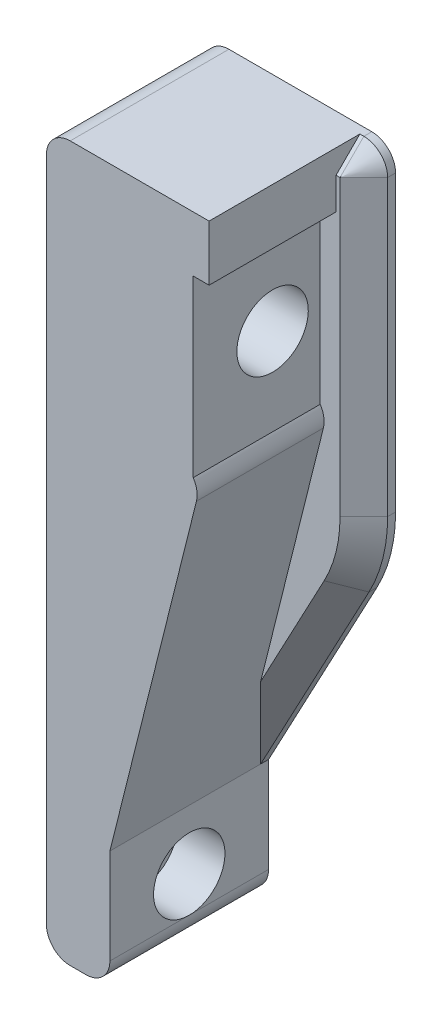
ISO-10303-21;
HEADER;
FILE_DESCRIPTION(('STEP AP214'),'2;1');
FILE_NAME('part.step','',(''),(''),'','','');
FILE_SCHEMA(('AUTOMOTIVE_DESIGN { 1 0 10303 214 1 1 1 1 }'));
ENDSEC;
DATA;
#1=APPLICATION_CONTEXT('core data for automotive mechanical design processes');
#2=APPLICATION_PROTOCOL_DEFINITION('international standard','automotive_design',2000,#1);
#3=PRODUCT_CONTEXT('',#1,'mechanical');
#4=PRODUCT('Part','Part','',(#3));
#5=PRODUCT_RELATED_PRODUCT_CATEGORY('part','',(#4));
#6=PRODUCT_DEFINITION_FORMATION('','',#4);
#7=PRODUCT_DEFINITION_CONTEXT('part definition',#1,'design');
#8=PRODUCT_DEFINITION('design','',#6,#7);
#9=PRODUCT_DEFINITION_SHAPE('','',#8);
#10=(LENGTH_UNIT() NAMED_UNIT(*) SI_UNIT(.MILLI.,.METRE.));
#11=(NAMED_UNIT(*) PLANE_ANGLE_UNIT() SI_UNIT($,.RADIAN.));
#12=(NAMED_UNIT(*) SI_UNIT($,.STERADIAN.) SOLID_ANGLE_UNIT());
#13=UNCERTAINTY_MEASURE_WITH_UNIT(LENGTH_MEASURE(1.E-05),#10,'distance_accuracy_value','');
#14=(GEOMETRIC_REPRESENTATION_CONTEXT(3) GLOBAL_UNCERTAINTY_ASSIGNED_CONTEXT((#13)) GLOBAL_UNIT_ASSIGNED_CONTEXT((#10,
#11,#12)) REPRESENTATION_CONTEXT('',''));
#15=CARTESIAN_POINT('',(0.,0.,0.));
#16=DIRECTION('',(0.,0.,1.));
#17=DIRECTION('',(1.,0.,0.));
#18=AXIS2_PLACEMENT_3D('',#15,#16,#17);
#19=CARTESIAN_POINT('',(0.,7.5,-10.));
#20=DIRECTION('',(1.,0.,0.));
#21=DIRECTION('',(0.,1.,0.));
#22=AXIS2_PLACEMENT_3D('',#19,#20,#21);
#23=CYLINDRICAL_SURFACE('',#22,2.5);
#24=CARTESIAN_POINT('',(0.,7.5,-10.));
#25=DIRECTION('',(1.,0.,0.));
#26=DIRECTION('',(0.,1.,0.));
#27=AXIS2_PLACEMENT_3D('',#24,#25,#26);
#28=CIRCLE('',#27,2.5);
#29=CARTESIAN_POINT('',(0.,10.,-10.));
#30=VERTEX_POINT('',#29);
#31=EDGE_CURVE('E203',#30,#30,#28,.T.);
#32=ORIENTED_EDGE('',*,*,#31,.F.);
#33=EDGE_LOOP('',(#32));
#34=FACE_BOUND('',#33,.T.);
#35=CARTESIAN_POINT('',(2.00000000000002,7.5,-10.));
#36=DIRECTION('',(1.,0.,0.));
#37=DIRECTION('',(0.,1.,0.));
#38=AXIS2_PLACEMENT_3D('',#35,#36,#37);
#39=CIRCLE('',#38,2.5);
#40=CARTESIAN_POINT('',(2.00000000000002,10.,-10.));
#41=VERTEX_POINT('',#40);
#42=EDGE_CURVE('E273',#41,#41,#39,.F.);
#43=ORIENTED_EDGE('',*,*,#42,.F.);
#44=EDGE_LOOP('',(#43));
#45=FACE_BOUND('',#44,.T.);
#46=ADVANCED_FACE('F39',(#34,#45),#23,.F.);
#47=CARTESIAN_POINT('',(0.,72.,-10.));
#48=DIRECTION('',(1.,0.,0.));
#49=DIRECTION('',(0.,1.,0.));
#50=AXIS2_PLACEMENT_3D('',#47,#48,#49);
#51=CYLINDRICAL_SURFACE('',#50,2.5);
#52=CARTESIAN_POINT('',(0.,72.,-10.));
#53=DIRECTION('',(1.,0.,0.));
#54=DIRECTION('',(0.,1.,0.));
#55=AXIS2_PLACEMENT_3D('',#52,#53,#54);
#56=CIRCLE('',#55,2.5);
#57=CARTESIAN_POINT('',(0.,74.5,-10.));
#58=VERTEX_POINT('',#57);
#59=EDGE_CURVE('E206',#58,#58,#56,.T.);
#60=ORIENTED_EDGE('',*,*,#59,.F.);
#61=EDGE_LOOP('',(#60));
#62=FACE_BOUND('',#61,.T.);
#63=CARTESIAN_POINT('',(2.00000000000001,72.,-10.));
#64=DIRECTION('',(1.,0.,0.));
#65=DIRECTION('',(0.,1.,0.));
#66=AXIS2_PLACEMENT_3D('',#63,#64,#65);
#67=CIRCLE('',#66,2.5);
#68=CARTESIAN_POINT('',(2.,74.5,-10.));
#69=VERTEX_POINT('',#68);
#70=EDGE_CURVE('E270',#69,#69,#67,.F.);
#71=ORIENTED_EDGE('',*,*,#70,.F.);
#72=EDGE_LOOP('',(#71));
#73=FACE_BOUND('',#72,.T.);
#74=ADVANCED_FACE('F452',(#62,#73),#51,.F.);
#75=CARTESIAN_POINT('',(24.,0.,-20.));
#76=DIRECTION('',(1.,0.,0.));
#77=DIRECTION('',(0.,0.,-1.));
#78=AXIS2_PLACEMENT_3D('',#75,#76,#77);
#79=PLANE('',#78);
#80=DIRECTION('',(0.,0.,1.));
#81=VECTOR('',#80,1.);
#82=CARTESIAN_POINT('',(24.,87.,-20.));
#83=LINE('',#82,#81);
#84=CARTESIAN_POINT('',(24.,87.,-20.));
#85=VERTEX_POINT('',#84);
#86=CARTESIAN_POINT('',(24.,87.,-19.));
#87=VERTEX_POINT('',#86);
#88=EDGE_CURVE('E304',#85,#87,#83,.T.);
#89=ORIENTED_EDGE('',*,*,#88,.T.);
#90=DIRECTION('',(0.,-1.,0.));
#91=VECTOR('',#90,1.);
#92=CARTESIAN_POINT('',(24.,0.,-19.));
#93=LINE('',#92,#91);
#94=CARTESIAN_POINT('',(24.,50.,-19.));
#95=VERTEX_POINT('',#94);
#96=EDGE_CURVE('E333',#87,#95,#93,.T.);
#97=ORIENTED_EDGE('',*,*,#96,.T.);
#98=DIRECTION('',(0.,0.,-1.));
#99=VECTOR('',#98,1.);
#100=CARTESIAN_POINT('',(24.,50.,-20.));
#101=LINE('',#100,#99);
#102=CARTESIAN_POINT('',(24.,50.,-20.));
#103=VERTEX_POINT('',#102);
#104=EDGE_CURVE('E257',#95,#103,#101,.T.);
#105=ORIENTED_EDGE('',*,*,#104,.T.);
#106=DIRECTION('',(0.,1.,0.));
#107=VECTOR('',#106,1.);
#108=CARTESIAN_POINT('',(24.,0.,-20.));
#109=LINE('',#108,#107);
#110=EDGE_CURVE('E251',#103,#85,#109,.T.);
#111=ORIENTED_EDGE('',*,*,#110,.T.);
#112=EDGE_LOOP('',(#89,#97,#105,#111));
#113=FACE_BOUND('',#112,.T.);
#114=ADVANCED_FACE('F458',(#113),#79,.T.);
#115=CARTESIAN_POINT('',(0.,0.,-20.));
#116=DIRECTION('',(-1.,0.,0.));
#117=DIRECTION('',(0.,0.,1.));
#118=AXIS2_PLACEMENT_3D('',#115,#116,#117);
#119=PLANE('',#118);
#120=ORIENTED_EDGE('',*,*,#31,.T.);
#121=EDGE_LOOP('',(#120));
#122=FACE_BOUND('',#121,.T.);
#123=ORIENTED_EDGE('',*,*,#59,.T.);
#124=EDGE_LOOP('',(#123));
#125=FACE_BOUND('',#124,.T.);
#126=DIRECTION('',(0.,-1.,0.));
#127=VECTOR('',#126,1.);
#128=CARTESIAN_POINT('',(0.,0.,0.));
#129=LINE('',#128,#127);
#130=CARTESIAN_POINT('',(0.,87.,0.));
#131=VERTEX_POINT('',#130);
#132=CARTESIAN_POINT('',(0.,3.,0.));
#133=VERTEX_POINT('',#132);
#134=EDGE_CURVE('E236',#131,#133,#129,.T.);
#135=ORIENTED_EDGE('',*,*,#134,.F.);
#136=DIRECTION('',(0.,0.,1.));
#137=VECTOR('',#136,1.);
#138=CARTESIAN_POINT('',(0.,87.,-20.));
#139=LINE('',#138,#137);
#140=CARTESIAN_POINT('',(0.,87.,-20.));
#141=VERTEX_POINT('',#140);
#142=EDGE_CURVE('E294',#131,#141,#139,.F.);
#143=ORIENTED_EDGE('',*,*,#142,.T.);
#144=DIRECTION('',(0.,-1.,0.));
#145=VECTOR('',#144,1.);
#146=CARTESIAN_POINT('',(0.,0.,-20.));
#147=LINE('',#146,#145);
#148=CARTESIAN_POINT('',(0.,3.,-20.));
#149=VERTEX_POINT('',#148);
#150=EDGE_CURVE('E244',#141,#149,#147,.T.);
#151=ORIENTED_EDGE('',*,*,#150,.T.);
#152=DIRECTION('',(0.,0.,1.));
#153=VECTOR('',#152,1.);
#154=CARTESIAN_POINT('',(0.,3.,-20.));
#155=LINE('',#154,#153);
#156=EDGE_CURVE('E291',#149,#133,#155,.T.);
#157=ORIENTED_EDGE('',*,*,#156,.T.);
#158=EDGE_LOOP('',(#135,#143,#151,#157));
#159=FACE_BOUND('',#158,.T.);
#160=ADVANCED_FACE('F426',(#122,#125,#159),#119,.T.);
#161=CARTESIAN_POINT('',(0.,90.,-20.));
#162=DIRECTION('',(0.,1.,0.));
#163=DIRECTION('',(0.,0.,1.));
#164=AXIS2_PLACEMENT_3D('',#161,#162,#163);
#165=PLANE('',#164);
#166=DIRECTION('',(0.,0.,1.));
#167=VECTOR('',#166,1.);
#168=CARTESIAN_POINT('',(20.5,90.,-16.));
#169=LINE('',#168,#167);
#170=CARTESIAN_POINT('',(20.5,90.,-19.));
#171=VERTEX_POINT('',#170);
#172=CARTESIAN_POINT('',(20.5,90.,0.));
#173=VERTEX_POINT('',#172);
#174=EDGE_CURVE('E241',#171,#173,#169,.T.);
#175=ORIENTED_EDGE('',*,*,#174,.F.);
#176=DIRECTION('',(1.,0.,0.));
#177=VECTOR('',#176,1.);
#178=CARTESIAN_POINT('',(0.,90.,-19.));
#179=LINE('',#178,#177);
#180=CARTESIAN_POINT('',(21.,90.,-19.));
#181=VERTEX_POINT('',#180);
#182=EDGE_CURVE('E329',#171,#181,#179,.T.);
#183=ORIENTED_EDGE('',*,*,#182,.T.);
#184=DIRECTION('',(0.,0.,1.));
#185=VECTOR('',#184,1.);
#186=CARTESIAN_POINT('',(21.,90.,-20.));
#187=LINE('',#186,#185);
#188=CARTESIAN_POINT('',(21.,90.,-20.));
#189=VERTEX_POINT('',#188);
#190=EDGE_CURVE('E269',#181,#189,#187,.F.);
#191=ORIENTED_EDGE('',*,*,#190,.T.);
#192=DIRECTION('',(-1.,0.,0.));
#193=VECTOR('',#192,1.);
#194=CARTESIAN_POINT('',(0.,90.,-20.));
#195=LINE('',#194,#193);
#196=CARTESIAN_POINT('',(3.,90.,-20.));
#197=VERTEX_POINT('',#196);
#198=EDGE_CURVE('E254',#189,#197,#195,.T.);
#199=ORIENTED_EDGE('',*,*,#198,.T.);
#200=DIRECTION('',(0.,0.,1.));
#201=VECTOR('',#200,1.);
#202=CARTESIAN_POINT('',(3.,90.,-20.));
#203=LINE('',#202,#201);
#204=CARTESIAN_POINT('',(3.,90.,0.));
#205=VERTEX_POINT('',#204);
#206=EDGE_CURVE('E280',#197,#205,#203,.T.);
#207=ORIENTED_EDGE('',*,*,#206,.T.);
#208=DIRECTION('',(-1.,0.,0.));
#209=VECTOR('',#208,1.);
#210=CARTESIAN_POINT('',(0.,90.,0.));
#211=LINE('',#210,#209);
#212=EDGE_CURVE('E248',#173,#205,#211,.T.);
#213=ORIENTED_EDGE('',*,*,#212,.F.);
#214=EDGE_LOOP('',(#175,#183,#191,#199,#207,#213));
#215=FACE_BOUND('',#214,.T.);
#216=ADVANCED_FACE('F417',(#215),#165,.T.);
#217=CARTESIAN_POINT('',(0.,0.,-20.));
#218=DIRECTION('',(0.,-1.,0.));
#219=DIRECTION('',(0.,0.,-1.));
#220=AXIS2_PLACEMENT_3D('',#217,#218,#219);
#221=PLANE('',#220);
#222=DIRECTION('',(1.,0.,0.));
#223=VECTOR('',#222,1.);
#224=CARTESIAN_POINT('',(0.,0.,-20.));
#225=LINE('',#224,#223);
#226=CARTESIAN_POINT('',(3.,0.,-20.));
#227=VERTEX_POINT('',#226);
#228=CARTESIAN_POINT('',(5.,0.,-20.));
#229=VERTEX_POINT('',#228);
#230=EDGE_CURVE('E247',#227,#229,#225,.T.);
#231=ORIENTED_EDGE('',*,*,#230,.T.);
#232=DIRECTION('',(0.,0.,1.));
#233=VECTOR('',#232,1.);
#234=CARTESIAN_POINT('',(5.,0.,0.));
#235=LINE('',#234,#233);
#236=CARTESIAN_POINT('',(5.,0.,0.));
#237=VERTEX_POINT('',#236);
#238=EDGE_CURVE('E312',#229,#237,#235,.T.);
#239=ORIENTED_EDGE('',*,*,#238,.T.);
#240=DIRECTION('',(1.,0.,0.));
#241=VECTOR('',#240,1.);
#242=CARTESIAN_POINT('',(0.,0.,0.));
#243=LINE('',#242,#241);
#244=CARTESIAN_POINT('',(3.,0.,0.));
#245=VERTEX_POINT('',#244);
#246=EDGE_CURVE('E260',#245,#237,#243,.T.);
#247=ORIENTED_EDGE('',*,*,#246,.F.);
#248=DIRECTION('',(0.,0.,1.));
#249=VECTOR('',#248,1.);
#250=CARTESIAN_POINT('',(3.,0.,-20.));
#251=LINE('',#250,#249);
#252=EDGE_CURVE('E310',#245,#227,#251,.F.);
#253=ORIENTED_EDGE('',*,*,#252,.T.);
#254=EDGE_LOOP('',(#231,#239,#247,#253));
#255=FACE_BOUND('',#254,.T.);
#256=ADVANCED_FACE('F434',(#255),#221,.T.);
#257=CARTESIAN_POINT('',(0.,0.,-20.));
#258=DIRECTION('',(0.,0.,-1.));
#259=DIRECTION('',(-1.,0.,0.));
#260=AXIS2_PLACEMENT_3D('',#257,#258,#259);
#261=PLANE('',#260);
#262=ORIENTED_EDGE('',*,*,#150,.F.);
#263=CARTESIAN_POINT('',(3.,87.,-20.));
#264=DIRECTION('',(0.,0.,-1.));
#265=DIRECTION('',(-1.,0.,0.));
#266=AXIS2_PLACEMENT_3D('',#263,#264,#265);
#267=CIRCLE('',#266,3.);
#268=EDGE_CURVE('E302',#141,#197,#267,.T.);
#269=ORIENTED_EDGE('',*,*,#268,.T.);
#270=ORIENTED_EDGE('',*,*,#198,.F.);
#271=CARTESIAN_POINT('',(21.,87.,-20.));
#272=DIRECTION('',(0.,0.,-1.));
#273=DIRECTION('',(-1.,0.,0.));
#274=AXIS2_PLACEMENT_3D('',#271,#272,#273);
#275=CIRCLE('',#274,3.);
#276=EDGE_CURVE('E300',#189,#85,#275,.T.);
#277=ORIENTED_EDGE('',*,*,#276,.T.);
#278=ORIENTED_EDGE('',*,*,#110,.F.);
#279=CARTESIAN_POINT('',(4.,50.,-20.));
#280=DIRECTION('',(0.,0.,-1.));
#281=DIRECTION('',(-1.,0.,0.));
#282=AXIS2_PLACEMENT_3D('',#279,#280,#281);
#283=CIRCLE('',#282,20.);
#284=CARTESIAN_POINT('',(21.6470588235294,40.5882352941177,-20.));
#285=VERTEX_POINT('',#284);
#286=EDGE_CURVE('E202',#103,#285,#283,.T.);
#287=ORIENTED_EDGE('',*,*,#286,.T.);
#288=DIRECTION('',(0.470588235294118,0.882352941176471,0.));
#289=VECTOR('',#288,1.);
#290=CARTESIAN_POINT('',(24.,45.,-20.));
#291=LINE('',#290,#289);
#292=CARTESIAN_POINT('',(8.,15.,-20.));
#293=VERTEX_POINT('',#292);
#294=EDGE_CURVE('E181',#293,#285,#291,.T.);
#295=ORIENTED_EDGE('',*,*,#294,.F.);
#296=DIRECTION('',(0.,1.,0.));
#297=VECTOR('',#296,1.);
#298=CARTESIAN_POINT('',(8.,15.,-20.));
#299=LINE('',#298,#297);
#300=CARTESIAN_POINT('',(8.,3.,-20.));
#301=VERTEX_POINT('',#300);
#302=EDGE_CURVE('E187',#301,#293,#299,.T.);
#303=ORIENTED_EDGE('',*,*,#302,.F.);
#304=CARTESIAN_POINT('',(5.,3.,-20.));
#305=DIRECTION('',(0.,0.,-1.));
#306=DIRECTION('',(-1.,0.,0.));
#307=AXIS2_PLACEMENT_3D('',#304,#305,#306);
#308=CIRCLE('',#307,3.);
#309=EDGE_CURVE('E298',#301,#229,#308,.T.);
#310=ORIENTED_EDGE('',*,*,#309,.T.);
#311=ORIENTED_EDGE('',*,*,#230,.F.);
#312=CARTESIAN_POINT('',(3.,3.,-20.));
#313=DIRECTION('',(0.,0.,-1.));
#314=DIRECTION('',(-1.,0.,0.));
#315=AXIS2_PLACEMENT_3D('',#312,#313,#314);
#316=CIRCLE('',#315,3.);
#317=EDGE_CURVE('E296',#227,#149,#316,.T.);
#318=ORIENTED_EDGE('',*,*,#317,.T.);
#319=EDGE_LOOP('',(#262,#269,#270,#277,#278,#287,#295,#303,#310,#311,#318));
#320=FACE_BOUND('',#319,.T.);
#321=ADVANCED_FACE('F199',(#320),#261,.T.);
#322=CARTESIAN_POINT('',(0.,0.,0.));
#323=DIRECTION('',(0.,0.,-1.));
#324=DIRECTION('',(-1.,0.,0.));
#325=AXIS2_PLACEMENT_3D('',#322,#323,#324);
#326=PLANE('',#325);
#327=ORIENTED_EDGE('',*,*,#212,.T.);
#328=CARTESIAN_POINT('',(3.,87.,0.));
#329=DIRECTION('',(0.,0.,-1.));
#330=DIRECTION('',(-1.,0.,0.));
#331=AXIS2_PLACEMENT_3D('',#328,#329,#330);
#332=CIRCLE('',#331,3.);
#333=EDGE_CURVE('E289',#205,#131,#332,.F.);
#334=ORIENTED_EDGE('',*,*,#333,.T.);
#335=ORIENTED_EDGE('',*,*,#134,.T.);
#336=CARTESIAN_POINT('',(3.,3.,0.));
#337=DIRECTION('',(0.,0.,-1.));
#338=DIRECTION('',(-1.,0.,0.));
#339=AXIS2_PLACEMENT_3D('',#336,#337,#338);
#340=CIRCLE('',#339,3.);
#341=EDGE_CURVE('E283',#133,#245,#340,.F.);
#342=ORIENTED_EDGE('',*,*,#341,.T.);
#343=ORIENTED_EDGE('',*,*,#246,.T.);
#344=CARTESIAN_POINT('',(5.,3.,0.));
#345=DIRECTION('',(0.,0.,-1.));
#346=DIRECTION('',(-1.,0.,0.));
#347=AXIS2_PLACEMENT_3D('',#344,#345,#346);
#348=CIRCLE('',#347,3.);
#349=CARTESIAN_POINT('',(8.,3.,0.));
#350=VERTEX_POINT('',#349);
#351=EDGE_CURVE('E285',#237,#350,#348,.F.);
#352=ORIENTED_EDGE('',*,*,#351,.T.);
#353=DIRECTION('',(0.,-1.,0.));
#354=VECTOR('',#353,1.);
#355=CARTESIAN_POINT('',(8.,0.,0.));
#356=LINE('',#355,#354);
#357=CARTESIAN_POINT('',(8.,15.,0.));
#358=VERTEX_POINT('',#357);
#359=EDGE_CURVE('E223',#358,#350,#356,.T.);
#360=ORIENTED_EDGE('',*,*,#359,.F.);
#361=DIRECTION('',(-0.242535625036333,-0.970142500145332,0.));
#362=VECTOR('',#361,1.);
#363=CARTESIAN_POINT('',(19.5,61.,0.));
#364=LINE('',#363,#362);
#365=CARTESIAN_POINT('',(18.9054154104634,58.6216616418535,0.));
#366=VERTEX_POINT('',#365);
#367=EDGE_CURVE('E186',#366,#358,#364,.T.);
#368=ORIENTED_EDGE('',*,*,#367,.F.);
#369=CARTESIAN_POINT('',(15.9949879100274,59.3492685169625,0.));
#370=DIRECTION('',(0.,0.,-1.));
#371=DIRECTION('',(-1.,0.,0.));
#372=AXIS2_PLACEMENT_3D('',#369,#370,#371);
#373=CIRCLE('',#372,3.);
#374=CARTESIAN_POINT('',(18.5,61.,0.));
#375=VERTEX_POINT('',#374);
#376=EDGE_CURVE('E287',#366,#375,#373,.F.);
#377=ORIENTED_EDGE('',*,*,#376,.T.);
#378=DIRECTION('',(0.,-1.,0.));
#379=VECTOR('',#378,1.);
#380=CARTESIAN_POINT('',(18.5,83.,0.));
#381=LINE('',#380,#379);
#382=CARTESIAN_POINT('',(18.5,83.,0.));
#383=VERTEX_POINT('',#382);
#384=EDGE_CURVE('E214',#383,#375,#381,.T.);
#385=ORIENTED_EDGE('',*,*,#384,.F.);
#386=DIRECTION('',(-1.,0.,0.));
#387=VECTOR('',#386,1.);
#388=CARTESIAN_POINT('',(20.5,83.,0.));
#389=LINE('',#388,#387);
#390=CARTESIAN_POINT('',(20.5,83.,0.));
#391=VERTEX_POINT('',#390);
#392=EDGE_CURVE('E228',#391,#383,#389,.T.);
#393=ORIENTED_EDGE('',*,*,#392,.F.);
#394=DIRECTION('',(0.,-1.,0.));
#395=VECTOR('',#394,1.);
#396=CARTESIAN_POINT('',(20.5,83.,0.));
#397=LINE('',#396,#395);
#398=EDGE_CURVE('E225',#173,#391,#397,.T.);
#399=ORIENTED_EDGE('',*,*,#398,.F.);
#400=EDGE_LOOP('',(#327,#334,#335,#342,#343,#352,#360,#368,#377,#385,#393,#399));
#401=FACE_BOUND('',#400,.T.);
#402=ADVANCED_FACE('F414',(#401),#326,.F.);
#403=CARTESIAN_POINT('',(19.5,61.,-16.));
#404=DIRECTION('',(-0.970142500145332,0.242535625036333,0.));
#405=DIRECTION('',(-0.242535625036333,-0.970142500145332,0.));
#406=AXIS2_PLACEMENT_3D('',#403,#404,#405);
#407=PLANE('',#406);
#408=DIRECTION('',(-0.242535625036333,-0.970142500145332,0.));
#409=VECTOR('',#408,1.);
#410=CARTESIAN_POINT('',(19.5,61.,-16.));
#411=LINE('',#410,#409);
#412=CARTESIAN_POINT('',(18.9054154104634,58.6216616418535,-16.));
#413=VERTEX_POINT('',#412);
#414=CARTESIAN_POINT('',(11.,27.0000000000001,-16.));
#415=VERTEX_POINT('',#414);
#416=EDGE_CURVE('E210',#413,#415,#411,.T.);
#417=ORIENTED_EDGE('',*,*,#416,.F.);
#418=DIRECTION('',(0.,0.,-1.));
#419=VECTOR('',#418,1.);
#420=CARTESIAN_POINT('',(18.9054154104634,58.6216616418535,-16.));
#421=LINE('',#420,#419);
#422=EDGE_CURVE('E307',#413,#366,#421,.F.);
#423=ORIENTED_EDGE('',*,*,#422,.T.);
#424=ORIENTED_EDGE('',*,*,#367,.T.);
#425=DIRECTION('',(0.,0.,1.));
#426=VECTOR('',#425,1.);
#427=CARTESIAN_POINT('',(8.,15.,-16.));
#428=LINE('',#427,#426);
#429=CARTESIAN_POINT('',(8.,15.,-19.));
#430=VERTEX_POINT('',#429);
#431=EDGE_CURVE('E56',#430,#358,#428,.T.);
#432=ORIENTED_EDGE('',*,*,#431,.F.);
#433=DIRECTION('',(0.235702260395516,0.942809041582064,0.235702260395514));
#434=VECTOR('',#433,1.);
#435=CARTESIAN_POINT('',(19.0277777777778,59.1111111111111,-7.97222222222229));
#436=LINE('',#435,#434);
#437=EDGE_CURVE('E11',#430,#415,#436,.T.);
#438=ORIENTED_EDGE('',*,*,#437,.T.);
#439=EDGE_LOOP('',(#417,#423,#424,#432,#438));
#440=FACE_BOUND('',#439,.T.);
#441=ADVANCED_FACE('F380',(#440),#407,.F.);
#442=CARTESIAN_POINT('',(18.5,83.,-16.));
#443=DIRECTION('',(-1.,0.,0.));
#444=DIRECTION('',(0.,-1.,0.));
#445=AXIS2_PLACEMENT_3D('',#442,#443,#444);
#446=PLANE('',#445);
#447=CARTESIAN_POINT('',(18.5,72.,-10.));
#448=DIRECTION('',(1.,0.,0.));
#449=DIRECTION('',(0.,1.,0.));
#450=AXIS2_PLACEMENT_3D('',#447,#448,#449);
#451=CIRCLE('',#450,4.5);
#452=CARTESIAN_POINT('',(18.5,76.5,-10.));
#453=VERTEX_POINT('',#452);
#454=EDGE_CURVE('E356',#453,#453,#451,.T.);
#455=ORIENTED_EDGE('',*,*,#454,.F.);
#456=EDGE_LOOP('',(#455));
#457=FACE_BOUND('',#456,.T.);
#458=ORIENTED_EDGE('',*,*,#384,.T.);
#459=DIRECTION('',(0.,0.,1.));
#460=VECTOR('',#459,1.);
#461=CARTESIAN_POINT('',(18.5,61.,-16.));
#462=LINE('',#461,#460);
#463=CARTESIAN_POINT('',(18.5,61.,-16.));
#464=VERTEX_POINT('',#463);
#465=EDGE_CURVE('E233',#464,#375,#462,.T.);
#466=ORIENTED_EDGE('',*,*,#465,.F.);
#467=DIRECTION('',(0.,-1.,0.));
#468=VECTOR('',#467,1.);
#469=CARTESIAN_POINT('',(18.5,83.,-16.));
#470=LINE('',#469,#468);
#471=CARTESIAN_POINT('',(18.5,83.,-16.));
#472=VERTEX_POINT('',#471);
#473=EDGE_CURVE('E219',#472,#464,#470,.T.);
#474=ORIENTED_EDGE('',*,*,#473,.F.);
#475=DIRECTION('',(0.,0.,1.));
#476=VECTOR('',#475,1.);
#477=CARTESIAN_POINT('',(18.5,83.,-16.));
#478=LINE('',#477,#476);
#479=EDGE_CURVE('E237',#472,#383,#478,.T.);
#480=ORIENTED_EDGE('',*,*,#479,.T.);
#481=EDGE_LOOP('',(#458,#466,#474,#480));
#482=FACE_BOUND('',#481,.T.);
#483=ADVANCED_FACE('F376',(#457,#482),#446,.F.);
#484=CARTESIAN_POINT('',(20.5,83.,-16.));
#485=DIRECTION('',(0.,1.,0.));
#486=DIRECTION('',(0.,0.,1.));
#487=AXIS2_PLACEMENT_3D('',#484,#485,#486);
#488=PLANE('',#487);
#489=ORIENTED_EDGE('',*,*,#392,.T.);
#490=ORIENTED_EDGE('',*,*,#479,.F.);
#491=DIRECTION('',(-1.,0.,0.));
#492=VECTOR('',#491,1.);
#493=CARTESIAN_POINT('',(20.5,83.,-16.));
#494=LINE('',#493,#492);
#495=CARTESIAN_POINT('',(20.5,83.,-16.));
#496=VERTEX_POINT('',#495);
#497=EDGE_CURVE('E216',#496,#472,#494,.T.);
#498=ORIENTED_EDGE('',*,*,#497,.F.);
#499=DIRECTION('',(0.,0.,1.));
#500=VECTOR('',#499,1.);
#501=CARTESIAN_POINT('',(20.5,83.,-16.));
#502=LINE('',#501,#500);
#503=EDGE_CURVE('E239',#496,#391,#502,.T.);
#504=ORIENTED_EDGE('',*,*,#503,.T.);
#505=EDGE_LOOP('',(#489,#490,#498,#504));
#506=FACE_BOUND('',#505,.T.);
#507=ADVANCED_FACE('F379',(#506),#488,.F.);
#508=CARTESIAN_POINT('',(20.5,83.,-16.));
#509=DIRECTION('',(-1.,0.,0.));
#510=DIRECTION('',(0.,0.,1.));
#511=AXIS2_PLACEMENT_3D('',#508,#509,#510);
#512=PLANE('',#511);
#513=ORIENTED_EDGE('',*,*,#398,.T.);
#514=ORIENTED_EDGE('',*,*,#503,.F.);
#515=DIRECTION('',(0.,-1.,0.));
#516=VECTOR('',#515,1.);
#517=CARTESIAN_POINT('',(20.5,83.,-16.));
#518=LINE('',#517,#516);
#519=CARTESIAN_POINT('',(20.5,87.,-16.));
#520=VERTEX_POINT('',#519);
#521=EDGE_CURVE('E213',#520,#496,#518,.T.);
#522=ORIENTED_EDGE('',*,*,#521,.F.);
#523=DIRECTION('',(0.,-0.707106781186549,0.707106781186546));
#524=VECTOR('',#523,1.);
#525=CARTESIAN_POINT('',(20.5,85.,-14.));
#526=LINE('',#525,#524);
#527=EDGE_CURVE('E49',#520,#171,#526,.F.);
#528=ORIENTED_EDGE('',*,*,#527,.T.);
#529=ORIENTED_EDGE('',*,*,#174,.T.);
#530=EDGE_LOOP('',(#513,#514,#522,#528,#529));
#531=FACE_BOUND('',#530,.T.);
#532=ADVANCED_FACE('F410',(#531),#512,.F.);
#533=CARTESIAN_POINT('',(8.,0.,-16.));
#534=DIRECTION('',(-1.,0.,0.));
#535=DIRECTION('',(0.,0.,1.));
#536=AXIS2_PLACEMENT_3D('',#533,#534,#535);
#537=PLANE('',#536);
#538=ORIENTED_EDGE('',*,*,#359,.T.);
#539=DIRECTION('',(0.,0.,1.));
#540=VECTOR('',#539,1.);
#541=CARTESIAN_POINT('',(8.,3.,-20.));
#542=LINE('',#541,#540);
#543=CARTESIAN_POINT('',(8.,3.,-10.));
#544=VERTEX_POINT('',#543);
#545=EDGE_CURVE('E316',#350,#544,#542,.F.);
#546=ORIENTED_EDGE('',*,*,#545,.T.);
#547=CARTESIAN_POINT('',(8.,7.5,-10.));
#548=DIRECTION('',(-1.,0.,0.));
#549=DIRECTION('',(0.,0.,1.));
#550=AXIS2_PLACEMENT_3D('',#547,#548,#549);
#551=CIRCLE('',#550,4.5);
#552=EDGE_CURVE('E277',#544,#544,#551,.T.);
#553=ORIENTED_EDGE('',*,*,#552,.T.);
#554=DIRECTION('',(0.,0.,1.));
#555=VECTOR('',#554,1.);
#556=CARTESIAN_POINT('',(8.,3.,-20.));
#557=LINE('',#556,#555);
#558=EDGE_CURVE('E194',#544,#301,#557,.F.);
#559=ORIENTED_EDGE('',*,*,#558,.T.);
#560=ORIENTED_EDGE('',*,*,#302,.T.);
#561=DIRECTION('',(0.,0.,-1.));
#562=VECTOR('',#561,1.);
#563=CARTESIAN_POINT('',(8.,15.,-10.));
#564=LINE('',#563,#562);
#565=EDGE_CURVE('E177',#430,#293,#564,.T.);
#566=ORIENTED_EDGE('',*,*,#565,.F.);
#567=ORIENTED_EDGE('',*,*,#431,.T.);
#568=EDGE_LOOP('',(#538,#546,#553,#559,#560,#566,#567));
#569=FACE_BOUND('',#568,.T.);
#570=ADVANCED_FACE('F191',(#569),#537,.F.);
#571=CARTESIAN_POINT('',(0.,0.,-16.));
#572=DIRECTION('',(0.,0.,1.));
#573=DIRECTION('',(1.,0.,0.));
#574=AXIS2_PLACEMENT_3D('',#571,#572,#573);
#575=PLANE('',#574);
#576=DIRECTION('',(0.,1.,0.));
#577=VECTOR('',#576,1.);
#578=CARTESIAN_POINT('',(21.,0.,-16.));
#579=LINE('',#578,#577);
#580=CARTESIAN_POINT('',(21.,50.,-16.));
#581=VERTEX_POINT('',#580);
#582=CARTESIAN_POINT('',(21.,87.,-16.));
#583=VERTEX_POINT('',#582);
#584=EDGE_CURVE('E324',#581,#583,#579,.T.);
#585=ORIENTED_EDGE('',*,*,#584,.T.);
#586=DIRECTION('',(-1.,0.,0.));
#587=VECTOR('',#586,1.);
#588=CARTESIAN_POINT('',(0.,87.,-16.));
#589=LINE('',#588,#587);
#590=EDGE_CURVE('E326',#583,#520,#589,.T.);
#591=ORIENTED_EDGE('',*,*,#590,.T.);
#592=ORIENTED_EDGE('',*,*,#521,.T.);
#593=ORIENTED_EDGE('',*,*,#497,.T.);
#594=ORIENTED_EDGE('',*,*,#473,.T.);
#595=CARTESIAN_POINT('',(15.9949879100274,59.3492685169625,-16.));
#596=DIRECTION('',(0.,0.,1.));
#597=DIRECTION('',(1.,0.,0.));
#598=AXIS2_PLACEMENT_3D('',#595,#596,#597);
#599=CIRCLE('',#598,3.);
#600=EDGE_CURVE('E318',#464,#413,#599,.F.);
#601=ORIENTED_EDGE('',*,*,#600,.T.);
#602=ORIENTED_EDGE('',*,*,#416,.T.);
#603=DIRECTION('',(0.470588235294118,0.882352941176471,0.));
#604=VECTOR('',#603,1.);
#605=CARTESIAN_POINT('',(19.,42.,-16.));
#606=LINE('',#605,#604);
#607=CARTESIAN_POINT('',(19.,42.,-16.));
#608=VERTEX_POINT('',#607);
#609=EDGE_CURVE('E320',#415,#608,#606,.T.);
#610=ORIENTED_EDGE('',*,*,#609,.T.);
#611=CARTESIAN_POINT('',(4.,50.,-16.));
#612=DIRECTION('',(0.,0.,1.));
#613=DIRECTION('',(1.,0.,0.));
#614=AXIS2_PLACEMENT_3D('',#611,#612,#613);
#615=CIRCLE('',#614,17.);
#616=EDGE_CURVE('E322',#608,#581,#615,.T.);
#617=ORIENTED_EDGE('',*,*,#616,.T.);
#618=EDGE_LOOP('',(#585,#591,#592,#593,#594,#601,#602,#610,#617));
#619=FACE_BOUND('',#618,.T.);
#620=ADVANCED_FACE('F392',(#619),#575,.T.);
#621=CARTESIAN_POINT('',(24.,45.,-10.));
#622=DIRECTION('',(-0.882352941176471,0.470588235294118,0.));
#623=DIRECTION('',(-0.470588235294118,-0.882352941176471,0.));
#624=AXIS2_PLACEMENT_3D('',#621,#622,#623);
#625=PLANE('',#624);
#626=DIRECTION('',(0.,0.,-1.));
#627=VECTOR('',#626,1.);
#628=CARTESIAN_POINT('',(21.6470588235294,40.5882352941177,-16.));
#629=LINE('',#628,#627);
#630=CARTESIAN_POINT('',(21.6470588235294,40.5882352941177,-19.));
#631=VERTEX_POINT('',#630);
#632=EDGE_CURVE('E267',#285,#631,#629,.F.);
#633=ORIENTED_EDGE('',*,*,#632,.T.);
#634=DIRECTION('',(-0.470588235294118,-0.882352941176471,0.));
#635=VECTOR('',#634,1.);
#636=CARTESIAN_POINT('',(8.,15.,-19.));
#637=LINE('',#636,#635);
#638=EDGE_CURVE('E183',#631,#430,#637,.T.);
#639=ORIENTED_EDGE('',*,*,#638,.T.);
#640=ORIENTED_EDGE('',*,*,#565,.T.);
#641=ORIENTED_EDGE('',*,*,#294,.T.);
#642=EDGE_LOOP('',(#633,#639,#640,#641));
#643=FACE_BOUND('',#642,.T.);
#644=ADVANCED_FACE('F179',(#643),#625,.F.);
#645=CARTESIAN_POINT('',(4.,50.,-20.));
#646=DIRECTION('',(0.,0.,1.));
#647=DIRECTION('',(1.,0.,0.));
#648=AXIS2_PLACEMENT_3D('',#645,#646,#647);
#649=CYLINDRICAL_SURFACE('',#648,20.);
#650=ORIENTED_EDGE('',*,*,#104,.F.);
#651=CARTESIAN_POINT('',(4.,50.,-19.));
#652=DIRECTION('',(0.,0.,1.));
#653=DIRECTION('',(1.,0.,0.));
#654=AXIS2_PLACEMENT_3D('',#651,#652,#653);
#655=CIRCLE('',#654,20.);
#656=EDGE_CURVE('E64',#95,#631,#655,.F.);
#657=ORIENTED_EDGE('',*,*,#656,.T.);
#658=ORIENTED_EDGE('',*,*,#632,.F.);
#659=ORIENTED_EDGE('',*,*,#286,.F.);
#660=EDGE_LOOP('',(#650,#657,#658,#659));
#661=FACE_BOUND('',#660,.T.);
#662=ADVANCED_FACE('F466',(#661),#649,.T.);
#663=CARTESIAN_POINT('',(2.00000000000001,72.,-10.));
#664=DIRECTION('',(1.,0.,0.));
#665=DIRECTION('',(0.,1.,0.));
#666=AXIS2_PLACEMENT_3D('',#663,#664,#665);
#667=PLANE('',#666);
#668=CARTESIAN_POINT('',(2.00000000000001,72.,-10.));
#669=DIRECTION('',(1.,0.,0.));
#670=DIRECTION('',(0.,1.,0.));
#671=AXIS2_PLACEMENT_3D('',#668,#669,#670);
#672=CIRCLE('',#671,4.5);
#673=CARTESIAN_POINT('',(2.,76.5,-10.));
#674=VERTEX_POINT('',#673);
#675=EDGE_CURVE('E274',#674,#674,#672,.T.);
#676=ORIENTED_EDGE('',*,*,#675,.T.);
#677=EDGE_LOOP('',(#676));
#678=FACE_BOUND('',#677,.T.);
#679=ORIENTED_EDGE('',*,*,#70,.T.);
#680=EDGE_LOOP('',(#679));
#681=FACE_BOUND('',#680,.T.);
#682=ADVANCED_FACE('F366',(#678,#681),#667,.T.);
#683=CARTESIAN_POINT('',(2.00000000000001,72.,-10.));
#684=DIRECTION('',(1.,0.,0.));
#685=DIRECTION('',(0.,1.,0.));
#686=AXIS2_PLACEMENT_3D('',#683,#684,#685);
#687=CYLINDRICAL_SURFACE('',#686,4.5);
#688=ORIENTED_EDGE('',*,*,#675,.F.);
#689=EDGE_LOOP('',(#688));
#690=FACE_BOUND('',#689,.T.);
#691=ORIENTED_EDGE('',*,*,#454,.T.);
#692=EDGE_LOOP('',(#691));
#693=FACE_BOUND('',#692,.T.);
#694=ADVANCED_FACE('F369',(#690,#693),#687,.F.);
#695=CARTESIAN_POINT('',(2.00000000000002,7.5,-10.));
#696=DIRECTION('',(1.,0.,0.));
#697=DIRECTION('',(0.,1.,0.));
#698=AXIS2_PLACEMENT_3D('',#695,#696,#697);
#699=CYLINDRICAL_SURFACE('',#698,4.5);
#700=CARTESIAN_POINT('',(2.00000000000002,7.5,-10.));
#701=DIRECTION('',(1.,0.,0.));
#702=DIRECTION('',(0.,1.,0.));
#703=AXIS2_PLACEMENT_3D('',#700,#701,#702);
#704=CIRCLE('',#703,4.5);
#705=CARTESIAN_POINT('',(2.00000000000002,12.,-10.));
#706=VERTEX_POINT('',#705);
#707=EDGE_CURVE('E351',#706,#706,#704,.T.);
#708=ORIENTED_EDGE('',*,*,#707,.F.);
#709=EDGE_LOOP('',(#708));
#710=FACE_BOUND('',#709,.T.);
#711=ORIENTED_EDGE('',*,*,#552,.F.);
#712=EDGE_LOOP('',(#711));
#713=FACE_BOUND('',#712,.T.);
#714=ADVANCED_FACE('F372',(#710,#713),#699,.F.);
#715=CARTESIAN_POINT('',(2.00000000000002,7.5,-10.));
#716=DIRECTION('',(1.,0.,0.));
#717=DIRECTION('',(0.,1.,0.));
#718=AXIS2_PLACEMENT_3D('',#715,#716,#717);
#719=PLANE('',#718);
#720=ORIENTED_EDGE('',*,*,#707,.T.);
#721=EDGE_LOOP('',(#720));
#722=FACE_BOUND('',#721,.T.);
#723=ORIENTED_EDGE('',*,*,#42,.T.);
#724=EDGE_LOOP('',(#723));
#725=FACE_BOUND('',#724,.T.);
#726=ADVANCED_FACE('F444',(#722,#725),#719,.T.);
#727=CARTESIAN_POINT('',(3.,87.,-20.));
#728=DIRECTION('',(0.,0.,1.));
#729=DIRECTION('',(1.,0.,0.));
#730=AXIS2_PLACEMENT_3D('',#727,#728,#729);
#731=CYLINDRICAL_SURFACE('',#730,3.);
#732=ORIENTED_EDGE('',*,*,#268,.F.);
#733=ORIENTED_EDGE('',*,*,#142,.F.);
#734=ORIENTED_EDGE('',*,*,#333,.F.);
#735=ORIENTED_EDGE('',*,*,#206,.F.);
#736=EDGE_LOOP('',(#732,#733,#734,#735));
#737=FACE_BOUND('',#736,.T.);
#738=ADVANCED_FACE('F422',(#737),#731,.T.);
#739=CARTESIAN_POINT('',(21.,87.,-20.));
#740=DIRECTION('',(0.,0.,1.));
#741=DIRECTION('',(1.,0.,0.));
#742=AXIS2_PLACEMENT_3D('',#739,#740,#741);
#743=CYLINDRICAL_SURFACE('',#742,3.);
#744=ORIENTED_EDGE('',*,*,#190,.F.);
#745=CARTESIAN_POINT('',(21.,87.,-19.));
#746=DIRECTION('',(0.,0.,1.));
#747=DIRECTION('',(1.,0.,0.));
#748=AXIS2_PLACEMENT_3D('',#745,#746,#747);
#749=CIRCLE('',#748,3.);
#750=EDGE_CURVE('E331',#181,#87,#749,.F.);
#751=ORIENTED_EDGE('',*,*,#750,.T.);
#752=ORIENTED_EDGE('',*,*,#88,.F.);
#753=ORIENTED_EDGE('',*,*,#276,.F.);
#754=EDGE_LOOP('',(#744,#751,#752,#753));
#755=FACE_BOUND('',#754,.T.);
#756=ADVANCED_FACE('F495',(#755),#743,.T.);
#757=CARTESIAN_POINT('',(15.9949879100274,59.3492685169625,-16.));
#758=DIRECTION('',(0.,0.,-1.));
#759=DIRECTION('',(-1.,0.,0.));
#760=AXIS2_PLACEMENT_3D('',#757,#758,#759);
#761=CYLINDRICAL_SURFACE('',#760,3.);
#762=ORIENTED_EDGE('',*,*,#600,.F.);
#763=ORIENTED_EDGE('',*,*,#465,.T.);
#764=ORIENTED_EDGE('',*,*,#376,.F.);
#765=ORIENTED_EDGE('',*,*,#422,.F.);
#766=EDGE_LOOP('',(#762,#763,#764,#765));
#767=FACE_BOUND('',#766,.T.);
#768=ADVANCED_FACE('F388',(#767),#761,.T.);
#769=CARTESIAN_POINT('',(5.,3.,-20.));
#770=DIRECTION('',(0.,0.,-1.));
#771=DIRECTION('',(-1.,0.,0.));
#772=AXIS2_PLACEMENT_3D('',#769,#770,#771);
#773=CYLINDRICAL_SURFACE('',#772,3.);
#774=ORIENTED_EDGE('',*,*,#558,.F.);
#775=ORIENTED_EDGE('',*,*,#545,.F.);
#776=ORIENTED_EDGE('',*,*,#351,.F.);
#777=ORIENTED_EDGE('',*,*,#238,.F.);
#778=ORIENTED_EDGE('',*,*,#309,.F.);
#779=EDGE_LOOP('',(#774,#775,#776,#777,#778));
#780=FACE_BOUND('',#779,.T.);
#781=ADVANCED_FACE('F438',(#780),#773,.T.);
#782=CARTESIAN_POINT('',(3.,3.,-20.));
#783=DIRECTION('',(0.,0.,1.));
#784=DIRECTION('',(1.,0.,0.));
#785=AXIS2_PLACEMENT_3D('',#782,#783,#784);
#786=CYLINDRICAL_SURFACE('',#785,3.);
#787=ORIENTED_EDGE('',*,*,#317,.F.);
#788=ORIENTED_EDGE('',*,*,#252,.F.);
#789=ORIENTED_EDGE('',*,*,#341,.F.);
#790=ORIENTED_EDGE('',*,*,#156,.F.);
#791=EDGE_LOOP('',(#787,#788,#789,#790));
#792=FACE_BOUND('',#791,.T.);
#793=ADVANCED_FACE('F430',(#792),#786,.T.);
#794=CARTESIAN_POINT('',(24.,45.,-19.));
#795=DIRECTION('',(0.623917748105775,-0.33275613232308,0.70710678118655));
#796=DIRECTION('',(0.470588235294118,0.882352941176471,0.));
#797=AXIS2_PLACEMENT_3D('',#794,#795,#796);
#798=PLANE('',#797);
#799=ORIENTED_EDGE('',*,*,#437,.F.);
#800=ORIENTED_EDGE('',*,*,#638,.F.);
#801=DIRECTION('',(0.623917748105779,-0.332756132323082,-0.707106781186545));
#802=VECTOR('',#801,1.);
#803=CARTESIAN_POINT('',(19.,42.,-16.));
#804=LINE('',#803,#802);
#805=EDGE_CURVE('E44',#608,#631,#804,.T.);
#806=ORIENTED_EDGE('',*,*,#805,.F.);
#807=ORIENTED_EDGE('',*,*,#609,.F.);
#808=EDGE_LOOP('',(#799,#800,#806,#807));
#809=FACE_BOUND('',#808,.T.);
#810=ADVANCED_FACE('F42',(#809),#798,.T.);
#811=CARTESIAN_POINT('',(4.,50.,-16.));
#812=DIRECTION('',(0.,0.,-1.));
#813=DIRECTION('',(-1.,0.,0.));
#814=AXIS2_PLACEMENT_3D('',#811,#812,#813);
#815=CONICAL_SURFACE('',#814,17.,0.785398163397451);
#816=ORIENTED_EDGE('',*,*,#805,.T.);
#817=ORIENTED_EDGE('',*,*,#656,.F.);
#818=DIRECTION('',(0.707106781186549,0.,-0.707106781186546));
#819=VECTOR('',#818,1.);
#820=CARTESIAN_POINT('',(21.,50.,-16.));
#821=LINE('',#820,#819);
#822=EDGE_CURVE('E344',#581,#95,#821,.T.);
#823=ORIENTED_EDGE('',*,*,#822,.F.);
#824=ORIENTED_EDGE('',*,*,#616,.F.);
#825=EDGE_LOOP('',(#816,#817,#823,#824));
#826=FACE_BOUND('',#825,.T.);
#827=ADVANCED_FACE('F397',(#826),#815,.T.);
#828=CARTESIAN_POINT('',(21.,0.,-16.));
#829=DIRECTION('',(-0.707106781186545,0.,-0.70710678118655));
#830=DIRECTION('',(0.,1.,0.));
#831=AXIS2_PLACEMENT_3D('',#828,#829,#830);
#832=PLANE('',#831);
#833=ORIENTED_EDGE('',*,*,#822,.T.);
#834=ORIENTED_EDGE('',*,*,#96,.F.);
#835=DIRECTION('',(0.70710678118655,0.,-0.707106781186545));
#836=VECTOR('',#835,1.);
#837=CARTESIAN_POINT('',(21.,87.,-16.));
#838=LINE('',#837,#836);
#839=EDGE_CURVE('E342',#583,#87,#838,.T.);
#840=ORIENTED_EDGE('',*,*,#839,.F.);
#841=ORIENTED_EDGE('',*,*,#584,.F.);
#842=EDGE_LOOP('',(#833,#834,#840,#841));
#843=FACE_BOUND('',#842,.T.);
#844=ADVANCED_FACE('F398',(#843),#832,.F.);
#845=CARTESIAN_POINT('',(21.,87.,-19.));
#846=DIRECTION('',(0.,0.,-1.));
#847=DIRECTION('',(-1.,0.,0.));
#848=AXIS2_PLACEMENT_3D('',#845,#846,#847);
#849=CONICAL_SURFACE('',#848,3.00000000000001,0.785398163397451);
#850=ORIENTED_EDGE('',*,*,#839,.T.);
#851=ORIENTED_EDGE('',*,*,#750,.F.);
#852=DIRECTION('',(0.,0.707106781186549,-0.707106781186546));
#853=VECTOR('',#852,1.);
#854=CARTESIAN_POINT('',(21.,87.,-16.));
#855=LINE('',#854,#853);
#856=EDGE_CURVE('E339',#583,#181,#855,.T.);
#857=ORIENTED_EDGE('',*,*,#856,.F.);
#858=EDGE_LOOP('',(#850,#851,#857));
#859=FACE_BOUND('',#858,.T.);
#860=ADVANCED_FACE('F403',(#859),#849,.T.);
#861=CARTESIAN_POINT('',(0.,87.,-16.));
#862=DIRECTION('',(0.,-0.707106781186546,-0.707106781186549));
#863=DIRECTION('',(-1.,0.,0.));
#864=AXIS2_PLACEMENT_3D('',#861,#862,#863);
#865=PLANE('',#864);
#866=ORIENTED_EDGE('',*,*,#856,.T.);
#867=ORIENTED_EDGE('',*,*,#182,.F.);
#868=ORIENTED_EDGE('',*,*,#527,.F.);
#869=ORIENTED_EDGE('',*,*,#590,.F.);
#870=EDGE_LOOP('',(#866,#867,#868,#869));
#871=FACE_BOUND('',#870,.T.);
#872=ADVANCED_FACE('F406',(#871),#865,.F.);
#873=CLOSED_SHELL('',(#46,#74,#114,#160,#216,#256,#321,#402,#441,#483,#507,#532,#570,#620,#644,
#662,#682,#694,#714,#726,#738,#756,#768,#781,#793,#810,#827,#844,#860,#872));
#874=MANIFOLD_SOLID_BREP('B2',#873);
#875=ADVANCED_BREP_SHAPE_REPRESENTATION('',(#18,#874),#14);
#876=SHAPE_DEFINITION_REPRESENTATION(#9,#875);
ENDSEC;
END-ISO-10303-21;
